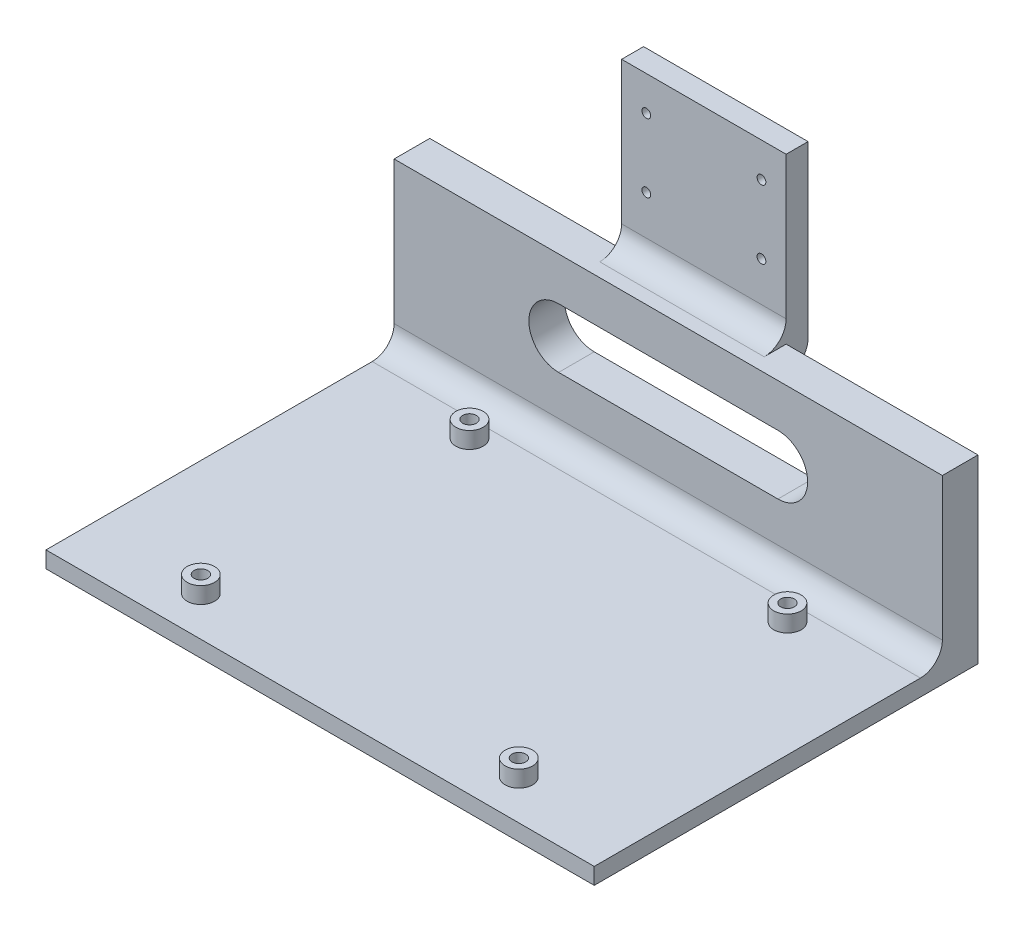
ISO-10303-21;
HEADER;
FILE_DESCRIPTION(('STEP AP214'),'2;1');
FILE_NAME('part.step','',(''),(''),'','','');
FILE_SCHEMA(('AUTOMOTIVE_DESIGN { 1 0 10303 214 1 1 1 1 }'));
ENDSEC;
DATA;
#1=APPLICATION_CONTEXT('core data for automotive mechanical design processes');
#2=APPLICATION_PROTOCOL_DEFINITION('international standard','automotive_design',2000,#1);
#3=PRODUCT_CONTEXT('',#1,'mechanical');
#4=PRODUCT('Part','Part','',(#3));
#5=PRODUCT_RELATED_PRODUCT_CATEGORY('part','',(#4));
#6=PRODUCT_DEFINITION_FORMATION('','',#4);
#7=PRODUCT_DEFINITION_CONTEXT('part definition',#1,'design');
#8=PRODUCT_DEFINITION('design','',#6,#7);
#9=PRODUCT_DEFINITION_SHAPE('','',#8);
#10=(LENGTH_UNIT() NAMED_UNIT(*) SI_UNIT(.MILLI.,.METRE.));
#11=(NAMED_UNIT(*) PLANE_ANGLE_UNIT() SI_UNIT($,.RADIAN.));
#12=(NAMED_UNIT(*) SI_UNIT($,.STERADIAN.) SOLID_ANGLE_UNIT());
#13=UNCERTAINTY_MEASURE_WITH_UNIT(LENGTH_MEASURE(1.E-05),#10,'distance_accuracy_value','');
#14=(GEOMETRIC_REPRESENTATION_CONTEXT(3) GLOBAL_UNCERTAINTY_ASSIGNED_CONTEXT((#13)) GLOBAL_UNIT_ASSIGNED_CONTEXT((#10,
#11,#12)) REPRESENTATION_CONTEXT('',''));
#15=CARTESIAN_POINT('',(0.,0.,0.));
#16=DIRECTION('',(0.,0.,1.));
#17=DIRECTION('',(1.,0.,0.));
#18=AXIS2_PLACEMENT_3D('',#15,#16,#17);
#19=CARTESIAN_POINT('',(50.,3.,-35.));
#20=DIRECTION('',(0.,0.,1.));
#21=DIRECTION('',(1.,0.,0.));
#22=AXIS2_PLACEMENT_3D('',#19,#20,#21);
#23=PLANE('',#22);
#24=DIRECTION('',(0.,1.,0.));
#25=VECTOR('',#24,1.);
#26=CARTESIAN_POINT('',(-15.,33.,-35.));
#27=LINE('',#26,#25);
#28=CARTESIAN_POINT('',(-15.,25.1356976526442,-35.));
#29=VERTEX_POINT('',#28);
#30=CARTESIAN_POINT('',(-15.,33.,-35.));
#31=VERTEX_POINT('',#30);
#32=EDGE_CURVE('E301',#29,#31,#27,.T.);
#33=ORIENTED_EDGE('',*,*,#32,.F.);
#34=DIRECTION('',(-1.,0.,0.));
#35=VECTOR('',#34,1.);
#36=CARTESIAN_POINT('',(50.,25.1356976526442,-35.));
#37=LINE('',#36,#35);
#38=CARTESIAN_POINT('',(-20.,25.1356976526442,-35.));
#39=VERTEX_POINT('',#38);
#40=EDGE_CURVE('E229',#29,#39,#37,.T.);
#41=ORIENTED_EDGE('',*,*,#40,.T.);
#42=CARTESIAN_POINT('',(-20.,19.7115763338752,-35.));
#43=DIRECTION('',(0.,0.,1.));
#44=DIRECTION('',(1.,0.,0.));
#45=AXIS2_PLACEMENT_3D('',#42,#43,#44);
#46=CIRCLE('',#45,5.42412131876902);
#47=CARTESIAN_POINT('',(-20.,14.2874550151061,-35.));
#48=VERTEX_POINT('',#47);
#49=EDGE_CURVE('E239',#39,#48,#46,.T.);
#50=ORIENTED_EDGE('',*,*,#49,.T.);
#51=DIRECTION('',(1.,0.,0.));
#52=VECTOR('',#51,1.);
#53=CARTESIAN_POINT('',(50.,14.2874550151061,-35.));
#54=LINE('',#53,#52);
#55=CARTESIAN_POINT('',(20.,14.2874550151061,-35.));
#56=VERTEX_POINT('',#55);
#57=EDGE_CURVE('E234',#48,#56,#54,.T.);
#58=ORIENTED_EDGE('',*,*,#57,.T.);
#59=CARTESIAN_POINT('',(20.,19.7115763338752,-35.));
#60=DIRECTION('',(0.,0.,1.));
#61=DIRECTION('',(1.,0.,0.));
#62=AXIS2_PLACEMENT_3D('',#59,#60,#61);
#63=CIRCLE('',#62,5.42412131876902);
#64=CARTESIAN_POINT('',(20.,25.1356976526442,-35.));
#65=VERTEX_POINT('',#64);
#66=EDGE_CURVE('E193',#56,#65,#63,.T.);
#67=ORIENTED_EDGE('',*,*,#66,.T.);
#68=CARTESIAN_POINT('',(15.,25.1356976526442,-35.));
#69=VERTEX_POINT('',#68);
#70=EDGE_CURVE('E233',#65,#69,#37,.T.);
#71=ORIENTED_EDGE('',*,*,#70,.T.);
#72=DIRECTION('',(0.,-1.,0.));
#73=VECTOR('',#72,1.);
#74=CARTESIAN_POINT('',(15.,33.,-35.));
#75=LINE('',#74,#73);
#76=CARTESIAN_POINT('',(15.,33.,-35.));
#77=VERTEX_POINT('',#76);
#78=EDGE_CURVE('E295',#77,#69,#75,.T.);
#79=ORIENTED_EDGE('',*,*,#78,.F.);
#80=DIRECTION('',(-1.,0.,0.));
#81=VECTOR('',#80,1.);
#82=CARTESIAN_POINT('',(-50.,33.,-35.));
#83=LINE('',#82,#81);
#84=CARTESIAN_POINT('',(50.,33.,-35.));
#85=VERTEX_POINT('',#84);
#86=EDGE_CURVE('E369',#85,#77,#83,.T.);
#87=ORIENTED_EDGE('',*,*,#86,.F.);
#88=DIRECTION('',(0.,-1.,0.));
#89=VECTOR('',#88,1.);
#90=CARTESIAN_POINT('',(50.,3.,-35.));
#91=LINE('',#90,#89);
#92=CARTESIAN_POINT('',(50.,0.,-35.));
#93=VERTEX_POINT('',#92);
#94=EDGE_CURVE('E408',#85,#93,#91,.T.);
#95=ORIENTED_EDGE('',*,*,#94,.T.);
#96=DIRECTION('',(-1.,0.,0.));
#97=VECTOR('',#96,1.);
#98=CARTESIAN_POINT('',(50.,0.,-35.));
#99=LINE('',#98,#97);
#100=CARTESIAN_POINT('',(-50.,0.,-35.));
#101=VERTEX_POINT('',#100);
#102=EDGE_CURVE('E386',#93,#101,#99,.T.);
#103=ORIENTED_EDGE('',*,*,#102,.T.);
#104=DIRECTION('',(0.,-1.,0.));
#105=VECTOR('',#104,1.);
#106=CARTESIAN_POINT('',(-50.,3.,-35.));
#107=LINE('',#106,#105);
#108=CARTESIAN_POINT('',(-50.,33.,-35.));
#109=VERTEX_POINT('',#108);
#110=EDGE_CURVE('E393',#109,#101,#107,.T.);
#111=ORIENTED_EDGE('',*,*,#110,.F.);
#112=EDGE_CURVE('E368',#31,#109,#83,.T.);
#113=ORIENTED_EDGE('',*,*,#112,.F.);
#114=EDGE_LOOP('',(#33,#41,#50,#58,#67,#71,#79,#87,#95,#103,#111,#113));
#115=FACE_BOUND('',#114,.T.);
#116=ADVANCED_FACE('F47',(#115),#23,.F.);
#117=CARTESIAN_POINT('',(29.,6.,27.75));
#118=DIRECTION('',(0.,-1.,0.));
#119=DIRECTION('',(0.,0.,-1.));
#120=AXIS2_PLACEMENT_3D('',#117,#118,#119);
#121=PLANE('',#120);
#122=CARTESIAN_POINT('',(29.,6.,27.75));
#123=DIRECTION('',(0.,-1.,0.));
#124=DIRECTION('',(0.,0.,-1.));
#125=AXIS2_PLACEMENT_3D('',#122,#123,#124);
#126=CIRCLE('',#125,2.5);
#127=CARTESIAN_POINT('',(29.,6.,25.25));
#128=VERTEX_POINT('',#127);
#129=EDGE_CURVE('E341',#128,#128,#126,.T.);
#130=ORIENTED_EDGE('',*,*,#129,.F.);
#131=EDGE_LOOP('',(#130));
#132=FACE_BOUND('',#131,.T.);
#133=CARTESIAN_POINT('',(29.,6.,27.75));
#134=DIRECTION('',(0.,1.,0.));
#135=DIRECTION('',(0.,0.,1.));
#136=AXIS2_PLACEMENT_3D('',#133,#134,#135);
#137=CIRCLE('',#136,1.25);
#138=CARTESIAN_POINT('',(29.,6.,29.));
#139=VERTEX_POINT('',#138);
#140=EDGE_CURVE('E325',#139,#139,#137,.T.);
#141=ORIENTED_EDGE('',*,*,#140,.F.);
#142=EDGE_LOOP('',(#141));
#143=FACE_BOUND('',#142,.T.);
#144=ADVANCED_FACE('F574',(#132,#143),#121,.F.);
#145=CARTESIAN_POINT('',(-50.,3.,35.));
#146=DIRECTION('',(1.,0.,0.));
#147=DIRECTION('',(0.,0.,-1.));
#148=AXIS2_PLACEMENT_3D('',#145,#146,#147);
#149=PLANE('',#148);
#150=DIRECTION('',(0.,0.,1.));
#151=VECTOR('',#150,1.);
#152=CARTESIAN_POINT('',(-50.,0.,35.));
#153=LINE('',#152,#151);
#154=CARTESIAN_POINT('',(-50.,0.,35.));
#155=VERTEX_POINT('',#154);
#156=EDGE_CURVE('E381',#101,#155,#153,.T.);
#157=ORIENTED_EDGE('',*,*,#156,.T.);
#158=DIRECTION('',(0.,-1.,0.));
#159=VECTOR('',#158,1.);
#160=CARTESIAN_POINT('',(-50.,3.,35.));
#161=LINE('',#160,#159);
#162=CARTESIAN_POINT('',(-50.,3.,35.));
#163=VERTEX_POINT('',#162);
#164=EDGE_CURVE('E416',#163,#155,#161,.T.);
#165=ORIENTED_EDGE('',*,*,#164,.F.);
#166=DIRECTION('',(0.,0.,1.));
#167=VECTOR('',#166,1.);
#168=CARTESIAN_POINT('',(-50.,3.,35.));
#169=LINE('',#168,#167);
#170=CARTESIAN_POINT('',(-50.,3.,-24.5));
#171=VERTEX_POINT('',#170);
#172=EDGE_CURVE('E382',#171,#163,#169,.T.);
#173=ORIENTED_EDGE('',*,*,#172,.F.);
#174=CARTESIAN_POINT('',(-50.,7.,-24.5));
#175=DIRECTION('',(1.,0.,0.));
#176=DIRECTION('',(0.,0.,-1.));
#177=AXIS2_PLACEMENT_3D('',#174,#175,#176);
#178=CIRCLE('',#177,4.);
#179=CARTESIAN_POINT('',(-50.,7.,-28.5));
#180=VERTEX_POINT('',#179);
#181=EDGE_CURVE('E56',#171,#180,#178,.T.);
#182=ORIENTED_EDGE('',*,*,#181,.T.);
#183=DIRECTION('',(0.,-1.,0.));
#184=VECTOR('',#183,1.);
#185=CARTESIAN_POINT('',(-50.,33.,-28.5));
#186=LINE('',#185,#184);
#187=CARTESIAN_POINT('',(-50.,33.,-28.5));
#188=VERTEX_POINT('',#187);
#189=EDGE_CURVE('E377',#188,#180,#186,.T.);
#190=ORIENTED_EDGE('',*,*,#189,.F.);
#191=DIRECTION('',(0.,0.,1.));
#192=VECTOR('',#191,1.);
#193=CARTESIAN_POINT('',(-50.,33.,-35.));
#194=LINE('',#193,#192);
#195=EDGE_CURVE('E357',#109,#188,#194,.T.);
#196=ORIENTED_EDGE('',*,*,#195,.F.);
#197=ORIENTED_EDGE('',*,*,#110,.T.);
#198=EDGE_LOOP('',(#157,#165,#173,#182,#190,#196,#197));
#199=FACE_BOUND('',#198,.T.);
#200=ADVANCED_FACE('F496',(#199),#149,.F.);
#201=CARTESIAN_POINT('',(50.,3.,35.));
#202=DIRECTION('',(0.,0.,-1.));
#203=DIRECTION('',(-1.,0.,0.));
#204=AXIS2_PLACEMENT_3D('',#201,#202,#203);
#205=PLANE('',#204);
#206=DIRECTION('',(1.,0.,0.));
#207=VECTOR('',#206,1.);
#208=CARTESIAN_POINT('',(50.,0.,35.));
#209=LINE('',#208,#207);
#210=CARTESIAN_POINT('',(50.,0.,35.));
#211=VERTEX_POINT('',#210);
#212=EDGE_CURVE('E397',#155,#211,#209,.T.);
#213=ORIENTED_EDGE('',*,*,#212,.T.);
#214=DIRECTION('',(0.,-1.,0.));
#215=VECTOR('',#214,1.);
#216=CARTESIAN_POINT('',(50.,3.,35.));
#217=LINE('',#216,#215);
#218=CARTESIAN_POINT('',(50.,3.,35.));
#219=VERTEX_POINT('',#218);
#220=EDGE_CURVE('E412',#219,#211,#217,.T.);
#221=ORIENTED_EDGE('',*,*,#220,.F.);
#222=DIRECTION('',(1.,0.,0.));
#223=VECTOR('',#222,1.);
#224=CARTESIAN_POINT('',(50.,3.,35.));
#225=LINE('',#224,#223);
#226=EDGE_CURVE('E385',#163,#219,#225,.T.);
#227=ORIENTED_EDGE('',*,*,#226,.F.);
#228=ORIENTED_EDGE('',*,*,#164,.T.);
#229=EDGE_LOOP('',(#213,#221,#227,#228));
#230=FACE_BOUND('',#229,.T.);
#231=ADVANCED_FACE('F512',(#230),#205,.F.);
#232=CARTESIAN_POINT('',(50.,3.,35.));
#233=DIRECTION('',(-1.,0.,0.));
#234=DIRECTION('',(0.,0.,1.));
#235=AXIS2_PLACEMENT_3D('',#232,#233,#234);
#236=PLANE('',#235);
#237=DIRECTION('',(0.,0.,-1.));
#238=VECTOR('',#237,1.);
#239=CARTESIAN_POINT('',(50.,0.,35.));
#240=LINE('',#239,#238);
#241=EDGE_CURVE('E400',#211,#93,#240,.T.);
#242=ORIENTED_EDGE('',*,*,#241,.T.);
#243=ORIENTED_EDGE('',*,*,#94,.F.);
#244=DIRECTION('',(0.,0.,-1.));
#245=VECTOR('',#244,1.);
#246=CARTESIAN_POINT('',(50.,33.,-35.));
#247=LINE('',#246,#245);
#248=CARTESIAN_POINT('',(50.,33.,-28.5));
#249=VERTEX_POINT('',#248);
#250=EDGE_CURVE('E364',#249,#85,#247,.T.);
#251=ORIENTED_EDGE('',*,*,#250,.F.);
#252=DIRECTION('',(0.,-1.,0.));
#253=VECTOR('',#252,1.);
#254=CARTESIAN_POINT('',(50.,33.,-28.5));
#255=LINE('',#254,#253);
#256=CARTESIAN_POINT('',(50.,7.,-28.5));
#257=VERTEX_POINT('',#256);
#258=EDGE_CURVE('E373',#249,#257,#255,.T.);
#259=ORIENTED_EDGE('',*,*,#258,.T.);
#260=CARTESIAN_POINT('',(50.,7.,-24.5));
#261=DIRECTION('',(-1.,0.,0.));
#262=DIRECTION('',(0.,0.,1.));
#263=AXIS2_PLACEMENT_3D('',#260,#261,#262);
#264=CIRCLE('',#263,4.);
#265=CARTESIAN_POINT('',(50.,3.,-24.5));
#266=VERTEX_POINT('',#265);
#267=EDGE_CURVE('E489',#257,#266,#264,.T.);
#268=ORIENTED_EDGE('',*,*,#267,.T.);
#269=DIRECTION('',(0.,0.,-1.));
#270=VECTOR('',#269,1.);
#271=CARTESIAN_POINT('',(50.,3.,35.));
#272=LINE('',#271,#270);
#273=EDGE_CURVE('E389',#219,#266,#272,.T.);
#274=ORIENTED_EDGE('',*,*,#273,.F.);
#275=ORIENTED_EDGE('',*,*,#220,.T.);
#276=EDGE_LOOP('',(#242,#243,#251,#259,#268,#274,#275));
#277=FACE_BOUND('',#276,.T.);
#278=ADVANCED_FACE('F505',(#277),#236,.F.);
#279=CARTESIAN_POINT('',(0.,3.,0.));
#280=DIRECTION('',(0.,1.,0.));
#281=DIRECTION('',(0.,0.,1.));
#282=AXIS2_PLACEMENT_3D('',#279,#280,#281);
#283=PLANE('',#282);
#284=CARTESIAN_POINT('',(-29.,3.,27.75));
#285=DIRECTION('',(0.,1.,0.));
#286=DIRECTION('',(0.,0.,1.));
#287=AXIS2_PLACEMENT_3D('',#284,#285,#286);
#288=CIRCLE('',#287,2.5);
#289=CARTESIAN_POINT('',(-29.,3.,30.25));
#290=VERTEX_POINT('',#289);
#291=EDGE_CURVE('E432',#290,#290,#288,.T.);
#292=ORIENTED_EDGE('',*,*,#291,.F.);
#293=EDGE_LOOP('',(#292));
#294=FACE_BOUND('',#293,.T.);
#295=CARTESIAN_POINT('',(29.,3.,-21.25));
#296=DIRECTION('',(0.,1.,0.));
#297=DIRECTION('',(0.,0.,1.));
#298=AXIS2_PLACEMENT_3D('',#295,#296,#297);
#299=CIRCLE('',#298,2.5);
#300=CARTESIAN_POINT('',(29.,3.,-18.75));
#301=VERTEX_POINT('',#300);
#302=EDGE_CURVE('E428',#301,#301,#299,.T.);
#303=ORIENTED_EDGE('',*,*,#302,.F.);
#304=EDGE_LOOP('',(#303));
#305=FACE_BOUND('',#304,.T.);
#306=CARTESIAN_POINT('',(29.,3.,27.75));
#307=DIRECTION('',(0.,1.,0.));
#308=DIRECTION('',(0.,0.,1.));
#309=AXIS2_PLACEMENT_3D('',#306,#307,#308);
#310=CIRCLE('',#309,2.5);
#311=CARTESIAN_POINT('',(29.,3.,30.25));
#312=VERTEX_POINT('',#311);
#313=EDGE_CURVE('E424',#312,#312,#310,.T.);
#314=ORIENTED_EDGE('',*,*,#313,.F.);
#315=EDGE_LOOP('',(#314));
#316=FACE_BOUND('',#315,.T.);
#317=CARTESIAN_POINT('',(-29.,3.,-21.25));
#318=DIRECTION('',(0.,1.,0.));
#319=DIRECTION('',(0.,0.,1.));
#320=AXIS2_PLACEMENT_3D('',#317,#318,#319);
#321=CIRCLE('',#320,2.5);
#322=CARTESIAN_POINT('',(-29.,3.,-18.75));
#323=VERTEX_POINT('',#322);
#324=EDGE_CURVE('E420',#323,#323,#321,.T.);
#325=ORIENTED_EDGE('',*,*,#324,.F.);
#326=EDGE_LOOP('',(#325));
#327=FACE_BOUND('',#326,.T.);
#328=ORIENTED_EDGE('',*,*,#273,.T.);
#329=DIRECTION('',(1.,0.,0.));
#330=VECTOR('',#329,1.);
#331=CARTESIAN_POINT('',(0.,3.,-24.5));
#332=LINE('',#331,#330);
#333=EDGE_CURVE('E486',#266,#171,#332,.F.);
#334=ORIENTED_EDGE('',*,*,#333,.T.);
#335=ORIENTED_EDGE('',*,*,#172,.T.);
#336=ORIENTED_EDGE('',*,*,#226,.T.);
#337=EDGE_LOOP('',(#328,#334,#335,#336));
#338=FACE_BOUND('',#337,.T.);
#339=ADVANCED_FACE('F508',(#294,#305,#316,#327,#338),#283,.T.);
#340=CARTESIAN_POINT('',(0.,0.,0.));
#341=DIRECTION('',(0.,1.,0.));
#342=DIRECTION('',(0.,0.,1.));
#343=AXIS2_PLACEMENT_3D('',#340,#341,#342);
#344=PLANE('',#343);
#345=CARTESIAN_POINT('',(-29.,0.,-21.25));
#346=DIRECTION('',(0.,1.,0.));
#347=DIRECTION('',(0.,0.,1.));
#348=AXIS2_PLACEMENT_3D('',#345,#346,#347);
#349=CIRCLE('',#348,1.25);
#350=CARTESIAN_POINT('',(-29.,0.,-20.));
#351=VERTEX_POINT('',#350);
#352=EDGE_CURVE('E313',#351,#351,#349,.T.);
#353=ORIENTED_EDGE('',*,*,#352,.T.);
#354=EDGE_LOOP('',(#353));
#355=FACE_BOUND('',#354,.T.);
#356=CARTESIAN_POINT('',(29.,0.,-21.25));
#357=DIRECTION('',(0.,1.,0.));
#358=DIRECTION('',(0.,0.,1.));
#359=AXIS2_PLACEMENT_3D('',#356,#357,#358);
#360=CIRCLE('',#359,1.25);
#361=CARTESIAN_POINT('',(29.,0.,-20.));
#362=VERTEX_POINT('',#361);
#363=EDGE_CURVE('E321',#362,#362,#360,.T.);
#364=ORIENTED_EDGE('',*,*,#363,.T.);
#365=EDGE_LOOP('',(#364));
#366=FACE_BOUND('',#365,.T.);
#367=CARTESIAN_POINT('',(29.,0.,27.75));
#368=DIRECTION('',(0.,1.,0.));
#369=DIRECTION('',(0.,0.,1.));
#370=AXIS2_PLACEMENT_3D('',#367,#368,#369);
#371=CIRCLE('',#370,1.25);
#372=CARTESIAN_POINT('',(29.,0.,29.));
#373=VERTEX_POINT('',#372);
#374=EDGE_CURVE('E329',#373,#373,#371,.T.);
#375=ORIENTED_EDGE('',*,*,#374,.T.);
#376=EDGE_LOOP('',(#375));
#377=FACE_BOUND('',#376,.T.);
#378=CARTESIAN_POINT('',(-29.,0.,27.75));
#379=DIRECTION('',(0.,1.,0.));
#380=DIRECTION('',(0.,0.,1.));
#381=AXIS2_PLACEMENT_3D('',#378,#379,#380);
#382=CIRCLE('',#381,1.25);
#383=CARTESIAN_POINT('',(-29.,0.,29.));
#384=VERTEX_POINT('',#383);
#385=EDGE_CURVE('E337',#384,#384,#382,.T.);
#386=ORIENTED_EDGE('',*,*,#385,.T.);
#387=EDGE_LOOP('',(#386));
#388=FACE_BOUND('',#387,.T.);
#389=ORIENTED_EDGE('',*,*,#156,.F.);
#390=ORIENTED_EDGE('',*,*,#102,.F.);
#391=ORIENTED_EDGE('',*,*,#241,.F.);
#392=ORIENTED_EDGE('',*,*,#212,.F.);
#393=EDGE_LOOP('',(#389,#390,#391,#392));
#394=FACE_BOUND('',#393,.T.);
#395=ADVANCED_FACE('F517',(#355,#366,#377,#388,#394),#344,.F.);
#396=CARTESIAN_POINT('',(-50.,33.,-28.5));
#397=DIRECTION('',(0.,0.,-1.));
#398=DIRECTION('',(-1.,0.,0.));
#399=AXIS2_PLACEMENT_3D('',#396,#397,#398);
#400=PLANE('',#399);
#401=DIRECTION('',(1.,0.,0.));
#402=VECTOR('',#401,1.);
#403=CARTESIAN_POINT('',(-20.,14.2874550151061,-28.5));
#404=LINE('',#403,#402);
#405=CARTESIAN_POINT('',(-20.,14.2874550151061,-28.5));
#406=VERTEX_POINT('',#405);
#407=CARTESIAN_POINT('',(20.,14.2874550151061,-28.5));
#408=VERTEX_POINT('',#407);
#409=EDGE_CURVE('E201',#406,#408,#404,.T.);
#410=ORIENTED_EDGE('',*,*,#409,.F.);
#411=CARTESIAN_POINT('',(-20.,19.7115763338752,-28.5));
#412=DIRECTION('',(0.,0.,1.));
#413=DIRECTION('',(1.,0.,0.));
#414=AXIS2_PLACEMENT_3D('',#411,#412,#413);
#415=CIRCLE('',#414,5.42412131876902);
#416=CARTESIAN_POINT('',(-20.,25.1356976526442,-28.5));
#417=VERTEX_POINT('',#416);
#418=EDGE_CURVE('E63',#417,#406,#415,.T.);
#419=ORIENTED_EDGE('',*,*,#418,.F.);
#420=DIRECTION('',(-1.,0.,0.));
#421=VECTOR('',#420,1.);
#422=CARTESIAN_POINT('',(-20.,25.1356976526442,-28.5));
#423=LINE('',#422,#421);
#424=CARTESIAN_POINT('',(20.,25.1356976526442,-28.5));
#425=VERTEX_POINT('',#424);
#426=EDGE_CURVE('E209',#425,#417,#423,.T.);
#427=ORIENTED_EDGE('',*,*,#426,.F.);
#428=CARTESIAN_POINT('',(20.,19.7115763338752,-28.5));
#429=DIRECTION('',(0.,0.,1.));
#430=DIRECTION('',(1.,0.,0.));
#431=AXIS2_PLACEMENT_3D('',#428,#429,#430);
#432=CIRCLE('',#431,5.42412131876902);
#433=EDGE_CURVE('E190',#408,#425,#432,.T.);
#434=ORIENTED_EDGE('',*,*,#433,.F.);
#435=EDGE_LOOP('',(#410,#419,#427,#434));
#436=FACE_BOUND('',#435,.T.);
#437=ORIENTED_EDGE('',*,*,#189,.T.);
#438=DIRECTION('',(1.,0.,0.));
#439=VECTOR('',#438,1.);
#440=CARTESIAN_POINT('',(-50.,7.,-28.5));
#441=LINE('',#440,#439);
#442=EDGE_CURVE('E479',#180,#257,#441,.T.);
#443=ORIENTED_EDGE('',*,*,#442,.T.);
#444=ORIENTED_EDGE('',*,*,#258,.F.);
#445=DIRECTION('',(1.,0.,0.));
#446=VECTOR('',#445,1.);
#447=CARTESIAN_POINT('',(-50.,33.,-28.5));
#448=LINE('',#447,#446);
#449=EDGE_CURVE('E361',#188,#249,#448,.T.);
#450=ORIENTED_EDGE('',*,*,#449,.F.);
#451=EDGE_LOOP('',(#437,#443,#444,#450));
#452=FACE_BOUND('',#451,.T.);
#453=ADVANCED_FACE('F206',(#436,#452),#400,.F.);
#454=CARTESIAN_POINT('',(0.,33.,0.));
#455=DIRECTION('',(0.,1.,0.));
#456=DIRECTION('',(0.,0.,1.));
#457=AXIS2_PLACEMENT_3D('',#454,#455,#456);
#458=PLANE('',#457);
#459=ORIENTED_EDGE('',*,*,#86,.T.);
#460=DIRECTION('',(0.,0.,1.));
#461=VECTOR('',#460,1.);
#462=CARTESIAN_POINT('',(15.,33.,0.));
#463=LINE('',#462,#461);
#464=CARTESIAN_POINT('',(15.,33.,-31.));
#465=VERTEX_POINT('',#464);
#466=EDGE_CURVE('E448',#77,#465,#463,.T.);
#467=ORIENTED_EDGE('',*,*,#466,.T.);
#468=DIRECTION('',(1.,0.,0.));
#469=VECTOR('',#468,1.);
#470=CARTESIAN_POINT('',(0.,33.,-31.));
#471=LINE('',#470,#469);
#472=CARTESIAN_POINT('',(-15.,33.,-31.));
#473=VERTEX_POINT('',#472);
#474=EDGE_CURVE('E444',#465,#473,#471,.F.);
#475=ORIENTED_EDGE('',*,*,#474,.T.);
#476=DIRECTION('',(0.,0.,-1.));
#477=VECTOR('',#476,1.);
#478=CARTESIAN_POINT('',(-15.,33.,0.));
#479=LINE('',#478,#477);
#480=EDGE_CURVE('E440',#473,#31,#479,.T.);
#481=ORIENTED_EDGE('',*,*,#480,.T.);
#482=ORIENTED_EDGE('',*,*,#112,.T.);
#483=ORIENTED_EDGE('',*,*,#195,.T.);
#484=ORIENTED_EDGE('',*,*,#449,.T.);
#485=ORIENTED_EDGE('',*,*,#250,.T.);
#486=EDGE_LOOP('',(#459,#467,#475,#481,#482,#483,#484,#485));
#487=FACE_BOUND('',#486,.T.);
#488=ADVANCED_FACE('F524',(#487),#458,.T.);
#489=CARTESIAN_POINT('',(-29.,6.,-21.25));
#490=DIRECTION('',(0.,-1.,0.));
#491=DIRECTION('',(0.,0.,-1.));
#492=AXIS2_PLACEMENT_3D('',#489,#490,#491);
#493=CYLINDRICAL_SURFACE('',#492,2.5);
#494=CARTESIAN_POINT('',(-29.,6.,-21.25));
#495=DIRECTION('',(0.,-1.,0.));
#496=DIRECTION('',(0.,0.,-1.));
#497=AXIS2_PLACEMENT_3D('',#494,#495,#496);
#498=CIRCLE('',#497,2.5);
#499=CARTESIAN_POINT('',(-29.,6.,-23.75));
#500=VERTEX_POINT('',#499);
#501=EDGE_CURVE('E350',#500,#500,#498,.T.);
#502=ORIENTED_EDGE('',*,*,#501,.T.);
#503=EDGE_LOOP('',(#502));
#504=FACE_BOUND('',#503,.T.);
#505=ORIENTED_EDGE('',*,*,#324,.T.);
#506=EDGE_LOOP('',(#505));
#507=FACE_BOUND('',#506,.T.);
#508=ADVANCED_FACE('F661',(#504,#507),#493,.T.);
#509=CARTESIAN_POINT('',(-29.,6.,-21.25));
#510=DIRECTION('',(0.,-1.,0.));
#511=DIRECTION('',(0.,0.,-1.));
#512=AXIS2_PLACEMENT_3D('',#509,#510,#511);
#513=PLANE('',#512);
#514=CARTESIAN_POINT('',(-29.,6.,-21.25));
#515=DIRECTION('',(0.,1.,0.));
#516=DIRECTION('',(0.,0.,1.));
#517=AXIS2_PLACEMENT_3D('',#514,#515,#516);
#518=CIRCLE('',#517,1.25);
#519=CARTESIAN_POINT('',(-29.,6.,-20.));
#520=VERTEX_POINT('',#519);
#521=EDGE_CURVE('E304',#520,#520,#518,.T.);
#522=ORIENTED_EDGE('',*,*,#521,.F.);
#523=EDGE_LOOP('',(#522));
#524=FACE_BOUND('',#523,.T.);
#525=ORIENTED_EDGE('',*,*,#501,.F.);
#526=EDGE_LOOP('',(#525));
#527=FACE_BOUND('',#526,.T.);
#528=ADVANCED_FACE('F642',(#524,#527),#513,.F.);
#529=CARTESIAN_POINT('',(29.,6.,27.75));
#530=DIRECTION('',(0.,-1.,0.));
#531=DIRECTION('',(0.,0.,-1.));
#532=AXIS2_PLACEMENT_3D('',#529,#530,#531);
#533=CYLINDRICAL_SURFACE('',#532,2.5);
#534=ORIENTED_EDGE('',*,*,#129,.T.);
#535=EDGE_LOOP('',(#534));
#536=FACE_BOUND('',#535,.T.);
#537=ORIENTED_EDGE('',*,*,#313,.T.);
#538=EDGE_LOOP('',(#537));
#539=FACE_BOUND('',#538,.T.);
#540=ADVANCED_FACE('F639',(#536,#539),#533,.T.);
#541=CARTESIAN_POINT('',(29.,6.,-21.25));
#542=DIRECTION('',(0.,-1.,0.));
#543=DIRECTION('',(0.,0.,-1.));
#544=AXIS2_PLACEMENT_3D('',#541,#542,#543);
#545=CYLINDRICAL_SURFACE('',#544,2.5);
#546=CARTESIAN_POINT('',(29.,6.,-21.25));
#547=DIRECTION('',(0.,-1.,0.));
#548=DIRECTION('',(0.,0.,-1.));
#549=AXIS2_PLACEMENT_3D('',#546,#547,#548);
#550=CIRCLE('',#549,2.5);
#551=CARTESIAN_POINT('',(29.,6.,-23.75));
#552=VERTEX_POINT('',#551);
#553=EDGE_CURVE('E345',#552,#552,#550,.T.);
#554=ORIENTED_EDGE('',*,*,#553,.T.);
#555=EDGE_LOOP('',(#554));
#556=FACE_BOUND('',#555,.T.);
#557=ORIENTED_EDGE('',*,*,#302,.T.);
#558=EDGE_LOOP('',(#557));
#559=FACE_BOUND('',#558,.T.);
#560=ADVANCED_FACE('F641',(#556,#559),#545,.T.);
#561=CARTESIAN_POINT('',(29.,6.,-21.25));
#562=DIRECTION('',(0.,-1.,0.));
#563=DIRECTION('',(0.,0.,-1.));
#564=AXIS2_PLACEMENT_3D('',#561,#562,#563);
#565=PLANE('',#564);
#566=CARTESIAN_POINT('',(29.,6.,-21.25));
#567=DIRECTION('',(0.,1.,0.));
#568=DIRECTION('',(0.,0.,1.));
#569=AXIS2_PLACEMENT_3D('',#566,#567,#568);
#570=CIRCLE('',#569,1.25);
#571=CARTESIAN_POINT('',(29.,6.,-20.));
#572=VERTEX_POINT('',#571);
#573=EDGE_CURVE('E317',#572,#572,#570,.T.);
#574=ORIENTED_EDGE('',*,*,#573,.F.);
#575=EDGE_LOOP('',(#574));
#576=FACE_BOUND('',#575,.T.);
#577=ORIENTED_EDGE('',*,*,#553,.F.);
#578=EDGE_LOOP('',(#577));
#579=FACE_BOUND('',#578,.T.);
#580=ADVANCED_FACE('F648',(#576,#579),#565,.F.);
#581=CARTESIAN_POINT('',(-29.,6.,27.75));
#582=DIRECTION('',(0.,-1.,0.));
#583=DIRECTION('',(0.,0.,-1.));
#584=AXIS2_PLACEMENT_3D('',#581,#582,#583);
#585=CYLINDRICAL_SURFACE('',#584,2.5);
#586=CARTESIAN_POINT('',(-29.,6.,27.75));
#587=DIRECTION('',(0.,-1.,0.));
#588=DIRECTION('',(0.,0.,-1.));
#589=AXIS2_PLACEMENT_3D('',#586,#587,#588);
#590=CIRCLE('',#589,2.5);
#591=CARTESIAN_POINT('',(-29.,6.,25.25));
#592=VERTEX_POINT('',#591);
#593=EDGE_CURVE('E346',#592,#592,#590,.T.);
#594=ORIENTED_EDGE('',*,*,#593,.T.);
#595=EDGE_LOOP('',(#594));
#596=FACE_BOUND('',#595,.T.);
#597=ORIENTED_EDGE('',*,*,#291,.T.);
#598=EDGE_LOOP('',(#597));
#599=FACE_BOUND('',#598,.T.);
#600=ADVANCED_FACE('F645',(#596,#599),#585,.T.);
#601=CARTESIAN_POINT('',(-29.,6.,27.75));
#602=DIRECTION('',(0.,-1.,0.));
#603=DIRECTION('',(0.,0.,-1.));
#604=AXIS2_PLACEMENT_3D('',#601,#602,#603);
#605=PLANE('',#604);
#606=CARTESIAN_POINT('',(-29.,6.,27.75));
#607=DIRECTION('',(0.,1.,0.));
#608=DIRECTION('',(0.,0.,1.));
#609=AXIS2_PLACEMENT_3D('',#606,#607,#608);
#610=CIRCLE('',#609,1.25);
#611=CARTESIAN_POINT('',(-29.,6.,29.));
#612=VERTEX_POINT('',#611);
#613=EDGE_CURVE('E333',#612,#612,#610,.T.);
#614=ORIENTED_EDGE('',*,*,#613,.F.);
#615=EDGE_LOOP('',(#614));
#616=FACE_BOUND('',#615,.T.);
#617=ORIENTED_EDGE('',*,*,#593,.F.);
#618=EDGE_LOOP('',(#617));
#619=FACE_BOUND('',#618,.T.);
#620=ADVANCED_FACE('F637',(#616,#619),#605,.F.);
#621=CARTESIAN_POINT('',(-29.,6.,27.75));
#622=DIRECTION('',(0.,1.,0.));
#623=DIRECTION('',(0.,0.,1.));
#624=AXIS2_PLACEMENT_3D('',#621,#622,#623);
#625=CYLINDRICAL_SURFACE('',#624,1.25);
#626=ORIENTED_EDGE('',*,*,#385,.F.);
#627=EDGE_LOOP('',(#626));
#628=FACE_BOUND('',#627,.T.);
#629=ORIENTED_EDGE('',*,*,#613,.T.);
#630=EDGE_LOOP('',(#629));
#631=FACE_BOUND('',#630,.T.);
#632=ADVANCED_FACE('F633',(#628,#631),#625,.F.);
#633=CARTESIAN_POINT('',(29.,6.,27.75));
#634=DIRECTION('',(0.,1.,0.));
#635=DIRECTION('',(0.,0.,1.));
#636=AXIS2_PLACEMENT_3D('',#633,#634,#635);
#637=CYLINDRICAL_SURFACE('',#636,1.25);
#638=ORIENTED_EDGE('',*,*,#374,.F.);
#639=EDGE_LOOP('',(#638));
#640=FACE_BOUND('',#639,.T.);
#641=ORIENTED_EDGE('',*,*,#140,.T.);
#642=EDGE_LOOP('',(#641));
#643=FACE_BOUND('',#642,.T.);
#644=ADVANCED_FACE('F629',(#640,#643),#637,.F.);
#645=CARTESIAN_POINT('',(29.,6.,-21.25));
#646=DIRECTION('',(0.,1.,0.));
#647=DIRECTION('',(0.,0.,1.));
#648=AXIS2_PLACEMENT_3D('',#645,#646,#647);
#649=CYLINDRICAL_SURFACE('',#648,1.25);
#650=ORIENTED_EDGE('',*,*,#363,.F.);
#651=EDGE_LOOP('',(#650));
#652=FACE_BOUND('',#651,.T.);
#653=ORIENTED_EDGE('',*,*,#573,.T.);
#654=EDGE_LOOP('',(#653));
#655=FACE_BOUND('',#654,.T.);
#656=ADVANCED_FACE('F625',(#652,#655),#649,.F.);
#657=CARTESIAN_POINT('',(-29.,6.,-21.25));
#658=DIRECTION('',(0.,1.,0.));
#659=DIRECTION('',(0.,0.,1.));
#660=AXIS2_PLACEMENT_3D('',#657,#658,#659);
#661=CYLINDRICAL_SURFACE('',#660,1.25);
#662=ORIENTED_EDGE('',*,*,#352,.F.);
#663=EDGE_LOOP('',(#662));
#664=FACE_BOUND('',#663,.T.);
#665=ORIENTED_EDGE('',*,*,#521,.T.);
#666=EDGE_LOOP('',(#665));
#667=FACE_BOUND('',#666,.T.);
#668=ADVANCED_FACE('F622',(#664,#667),#661,.F.);
#669=CARTESIAN_POINT('',(15.,33.,-39.));
#670=DIRECTION('',(-1.,0.,0.));
#671=DIRECTION('',(0.,0.,1.));
#672=AXIS2_PLACEMENT_3D('',#669,#670,#671);
#673=PLANE('',#672);
#674=ORIENTED_EDGE('',*,*,#78,.T.);
#675=DIRECTION('',(0.,0.,-1.));
#676=VECTOR('',#675,1.);
#677=CARTESIAN_POINT('',(15.,25.1356976526442,-39.));
#678=LINE('',#677,#676);
#679=CARTESIAN_POINT('',(15.,25.1356976526442,-35.0023023942441));
#680=VERTEX_POINT('',#679);
#681=EDGE_CURVE('E225',#69,#680,#678,.T.);
#682=ORIENTED_EDGE('',*,*,#681,.T.);
#683=CARTESIAN_POINT('',(15.,25.,-39.));
#684=DIRECTION('',(-1.,0.,0.));
#685=DIRECTION('',(0.,0.,1.));
#686=AXIS2_PLACEMENT_3D('',#683,#684,#685);
#687=CIRCLE('',#686,4.);
#688=CARTESIAN_POINT('',(15.,28.4641016151378,-37.));
#689=VERTEX_POINT('',#688);
#690=EDGE_CURVE('E462',#680,#689,#687,.T.);
#691=ORIENTED_EDGE('',*,*,#690,.T.);
#692=CARTESIAN_POINT('',(15.,31.9282032302755,-35.));
#693=DIRECTION('',(-1.,0.,0.));
#694=DIRECTION('',(0.,0.,1.));
#695=AXIS2_PLACEMENT_3D('',#692,#693,#694);
#696=CIRCLE('',#695,4.);
#697=CARTESIAN_POINT('',(15.,31.9282032302755,-39.));
#698=VERTEX_POINT('',#697);
#699=EDGE_CURVE('E476',#689,#698,#696,.F.);
#700=ORIENTED_EDGE('',*,*,#699,.T.);
#701=DIRECTION('',(0.,-1.,0.));
#702=VECTOR('',#701,1.);
#703=CARTESIAN_POINT('',(15.,33.,-39.));
#704=LINE('',#703,#702);
#705=CARTESIAN_POINT('',(15.,63.,-39.));
#706=VERTEX_POINT('',#705);
#707=EDGE_CURVE('E296',#706,#698,#704,.T.);
#708=ORIENTED_EDGE('',*,*,#707,.F.);
#709=DIRECTION('',(0.,0.,-1.));
#710=VECTOR('',#709,1.);
#711=CARTESIAN_POINT('',(15.,63.,-39.));
#712=LINE('',#711,#710);
#713=CARTESIAN_POINT('',(15.,63.,-35.));
#714=VERTEX_POINT('',#713);
#715=EDGE_CURVE('E279',#714,#706,#712,.T.);
#716=ORIENTED_EDGE('',*,*,#715,.F.);
#717=DIRECTION('',(0.,-1.,0.));
#718=VECTOR('',#717,1.);
#719=CARTESIAN_POINT('',(15.,63.,-35.));
#720=LINE('',#719,#718);
#721=CARTESIAN_POINT('',(15.,37.,-35.));
#722=VERTEX_POINT('',#721);
#723=EDGE_CURVE('E287',#714,#722,#720,.T.);
#724=ORIENTED_EDGE('',*,*,#723,.T.);
#725=CARTESIAN_POINT('',(15.,37.,-31.));
#726=DIRECTION('',(-1.,0.,0.));
#727=DIRECTION('',(0.,0.,1.));
#728=AXIS2_PLACEMENT_3D('',#725,#726,#727);
#729=CIRCLE('',#728,4.);
#730=EDGE_CURVE('E452',#722,#465,#729,.T.);
#731=ORIENTED_EDGE('',*,*,#730,.T.);
#732=ORIENTED_EDGE('',*,*,#466,.F.);
#733=EDGE_LOOP('',(#674,#682,#691,#700,#708,#716,#724,#731,#732));
#734=FACE_BOUND('',#733,.T.);
#735=ADVANCED_FACE('F530',(#734),#673,.F.);
#736=CARTESIAN_POINT('',(-15.,33.,-39.));
#737=DIRECTION('',(1.,0.,0.));
#738=DIRECTION('',(0.,0.,-1.));
#739=AXIS2_PLACEMENT_3D('',#736,#737,#738);
#740=PLANE('',#739);
#741=CARTESIAN_POINT('',(-15.,25.,-39.));
#742=DIRECTION('',(1.,0.,0.));
#743=DIRECTION('',(0.,0.,-1.));
#744=AXIS2_PLACEMENT_3D('',#741,#742,#743);
#745=CIRCLE('',#744,4.);
#746=CARTESIAN_POINT('',(-15.,28.4641016151378,-37.));
#747=VERTEX_POINT('',#746);
#748=CARTESIAN_POINT('',(-15.,25.1356976526442,-35.0023023942441));
#749=VERTEX_POINT('',#748);
#750=EDGE_CURVE('E458',#747,#749,#745,.T.);
#751=ORIENTED_EDGE('',*,*,#750,.T.);
#752=DIRECTION('',(0.,0.,1.));
#753=VECTOR('',#752,1.);
#754=CARTESIAN_POINT('',(-15.,25.1356976526442,-39.));
#755=LINE('',#754,#753);
#756=EDGE_CURVE('E71',#749,#29,#755,.T.);
#757=ORIENTED_EDGE('',*,*,#756,.T.);
#758=ORIENTED_EDGE('',*,*,#32,.T.);
#759=ORIENTED_EDGE('',*,*,#480,.F.);
#760=CARTESIAN_POINT('',(-15.,37.,-31.));
#761=DIRECTION('',(1.,0.,0.));
#762=DIRECTION('',(0.,0.,-1.));
#763=AXIS2_PLACEMENT_3D('',#760,#761,#762);
#764=CIRCLE('',#763,4.);
#765=CARTESIAN_POINT('',(-15.,37.,-35.));
#766=VERTEX_POINT('',#765);
#767=EDGE_CURVE('E455',#473,#766,#764,.T.);
#768=ORIENTED_EDGE('',*,*,#767,.T.);
#769=DIRECTION('',(0.,-1.,0.));
#770=VECTOR('',#769,1.);
#771=CARTESIAN_POINT('',(-15.,63.,-35.));
#772=LINE('',#771,#770);
#773=CARTESIAN_POINT('',(-15.,63.,-35.));
#774=VERTEX_POINT('',#773);
#775=EDGE_CURVE('E291',#774,#766,#772,.T.);
#776=ORIENTED_EDGE('',*,*,#775,.F.);
#777=DIRECTION('',(0.,0.,1.));
#778=VECTOR('',#777,1.);
#779=CARTESIAN_POINT('',(-15.,63.,-39.));
#780=LINE('',#779,#778);
#781=CARTESIAN_POINT('',(-15.,63.,-39.));
#782=VERTEX_POINT('',#781);
#783=EDGE_CURVE('E272',#782,#774,#780,.T.);
#784=ORIENTED_EDGE('',*,*,#783,.F.);
#785=DIRECTION('',(0.,1.,0.));
#786=VECTOR('',#785,1.);
#787=CARTESIAN_POINT('',(-15.,33.,-39.));
#788=LINE('',#787,#786);
#789=CARTESIAN_POINT('',(-15.,31.9282032302755,-39.));
#790=VERTEX_POINT('',#789);
#791=EDGE_CURVE('E300',#790,#782,#788,.T.);
#792=ORIENTED_EDGE('',*,*,#791,.F.);
#793=CARTESIAN_POINT('',(-15.,31.9282032302755,-35.));
#794=DIRECTION('',(1.,0.,0.));
#795=DIRECTION('',(0.,0.,-1.));
#796=AXIS2_PLACEMENT_3D('',#793,#794,#795);
#797=CIRCLE('',#796,4.);
#798=EDGE_CURVE('E469',#790,#747,#797,.F.);
#799=ORIENTED_EDGE('',*,*,#798,.T.);
#800=EDGE_LOOP('',(#751,#757,#758,#759,#768,#776,#784,#792,#799));
#801=FACE_BOUND('',#800,.T.);
#802=ADVANCED_FACE('F539',(#801),#740,.F.);
#803=CARTESIAN_POINT('',(0.,0.,-39.));
#804=DIRECTION('',(0.,0.,-1.));
#805=DIRECTION('',(-1.,0.,0.));
#806=AXIS2_PLACEMENT_3D('',#803,#804,#805);
#807=PLANE('',#806);
#808=CARTESIAN_POINT('',(10.5,56.7286046947115,-39.));
#809=DIRECTION('',(0.,0.,-1.));
#810=DIRECTION('',(-1.,0.,0.));
#811=AXIS2_PLACEMENT_3D('',#808,#809,#810);
#812=CIRCLE('',#811,0.799999999999999);
#813=CARTESIAN_POINT('',(9.7,56.7286046947115,-39.));
#814=VERTEX_POINT('',#813);
#815=EDGE_CURVE('E243',#814,#814,#812,.T.);
#816=ORIENTED_EDGE('',*,*,#815,.F.);
#817=EDGE_LOOP('',(#816));
#818=FACE_BOUND('',#817,.T.);
#819=CARTESIAN_POINT('',(-10.5,56.7286046947115,-39.));
#820=DIRECTION('',(0.,0.,-1.));
#821=DIRECTION('',(-1.,0.,0.));
#822=AXIS2_PLACEMENT_3D('',#819,#820,#821);
#823=CIRCLE('',#822,0.799999999999999);
#824=CARTESIAN_POINT('',(-11.3,56.7286046947115,-39.));
#825=VERTEX_POINT('',#824);
#826=EDGE_CURVE('E251',#825,#825,#823,.T.);
#827=ORIENTED_EDGE('',*,*,#826,.F.);
#828=EDGE_LOOP('',(#827));
#829=FACE_BOUND('',#828,.T.);
#830=CARTESIAN_POINT('',(-10.5,44.2286046947115,-39.));
#831=DIRECTION('',(0.,0.,-1.));
#832=DIRECTION('',(-1.,0.,0.));
#833=AXIS2_PLACEMENT_3D('',#830,#831,#832);
#834=CIRCLE('',#833,0.799999999999999);
#835=CARTESIAN_POINT('',(-11.3,44.2286046947115,-39.));
#836=VERTEX_POINT('',#835);
#837=EDGE_CURVE('E259',#836,#836,#834,.T.);
#838=ORIENTED_EDGE('',*,*,#837,.F.);
#839=EDGE_LOOP('',(#838));
#840=FACE_BOUND('',#839,.T.);
#841=CARTESIAN_POINT('',(10.5,44.2286046947115,-39.));
#842=DIRECTION('',(0.,0.,-1.));
#843=DIRECTION('',(-1.,0.,0.));
#844=AXIS2_PLACEMENT_3D('',#841,#842,#843);
#845=CIRCLE('',#844,0.799999999999999);
#846=CARTESIAN_POINT('',(9.7,44.2286046947115,-39.));
#847=VERTEX_POINT('',#846);
#848=EDGE_CURVE('E267',#847,#847,#845,.T.);
#849=ORIENTED_EDGE('',*,*,#848,.F.);
#850=EDGE_LOOP('',(#849));
#851=FACE_BOUND('',#850,.T.);
#852=ORIENTED_EDGE('',*,*,#707,.T.);
#853=DIRECTION('',(-1.,0.,0.));
#854=VECTOR('',#853,1.);
#855=CARTESIAN_POINT('',(-15.,31.9282032302755,-39.));
#856=LINE('',#855,#854);
#857=EDGE_CURVE('E465',#698,#790,#856,.T.);
#858=ORIENTED_EDGE('',*,*,#857,.T.);
#859=ORIENTED_EDGE('',*,*,#791,.T.);
#860=DIRECTION('',(-1.,0.,0.));
#861=VECTOR('',#860,1.);
#862=CARTESIAN_POINT('',(-15.,63.,-39.));
#863=LINE('',#862,#861);
#864=EDGE_CURVE('E283',#706,#782,#863,.T.);
#865=ORIENTED_EDGE('',*,*,#864,.F.);
#866=EDGE_LOOP('',(#852,#858,#859,#865));
#867=FACE_BOUND('',#866,.T.);
#868=ADVANCED_FACE('F551',(#818,#829,#840,#851,#867),#807,.T.);
#869=CARTESIAN_POINT('',(-15.,63.,-35.));
#870=DIRECTION('',(0.,0.,-1.));
#871=DIRECTION('',(-1.,0.,0.));
#872=AXIS2_PLACEMENT_3D('',#869,#870,#871);
#873=PLANE('',#872);
#874=CARTESIAN_POINT('',(10.5,56.7286046947115,-35.));
#875=DIRECTION('',(0.,0.,-1.));
#876=DIRECTION('',(-1.,0.,0.));
#877=AXIS2_PLACEMENT_3D('',#874,#875,#876);
#878=CIRCLE('',#877,0.799999999999998);
#879=CARTESIAN_POINT('',(9.7,56.7286046947115,-35.));
#880=VERTEX_POINT('',#879);
#881=EDGE_CURVE('E247',#880,#880,#878,.T.);
#882=ORIENTED_EDGE('',*,*,#881,.T.);
#883=EDGE_LOOP('',(#882));
#884=FACE_BOUND('',#883,.T.);
#885=CARTESIAN_POINT('',(-10.5,56.7286046947115,-35.));
#886=DIRECTION('',(0.,0.,-1.));
#887=DIRECTION('',(-1.,0.,0.));
#888=AXIS2_PLACEMENT_3D('',#885,#886,#887);
#889=CIRCLE('',#888,0.799999999999998);
#890=CARTESIAN_POINT('',(-11.3,56.7286046947115,-35.));
#891=VERTEX_POINT('',#890);
#892=EDGE_CURVE('E255',#891,#891,#889,.T.);
#893=ORIENTED_EDGE('',*,*,#892,.T.);
#894=EDGE_LOOP('',(#893));
#895=FACE_BOUND('',#894,.T.);
#896=CARTESIAN_POINT('',(-10.5,44.2286046947115,-35.));
#897=DIRECTION('',(0.,0.,-1.));
#898=DIRECTION('',(-1.,0.,0.));
#899=AXIS2_PLACEMENT_3D('',#896,#897,#898);
#900=CIRCLE('',#899,0.799999999999998);
#901=CARTESIAN_POINT('',(-11.3,44.2286046947115,-35.));
#902=VERTEX_POINT('',#901);
#903=EDGE_CURVE('E263',#902,#902,#900,.T.);
#904=ORIENTED_EDGE('',*,*,#903,.T.);
#905=EDGE_LOOP('',(#904));
#906=FACE_BOUND('',#905,.T.);
#907=CARTESIAN_POINT('',(10.5,44.2286046947115,-35.));
#908=DIRECTION('',(0.,0.,-1.));
#909=DIRECTION('',(-1.,0.,0.));
#910=AXIS2_PLACEMENT_3D('',#907,#908,#909);
#911=CIRCLE('',#910,0.799999999999998);
#912=CARTESIAN_POINT('',(9.7,44.2286046947115,-35.));
#913=VERTEX_POINT('',#912);
#914=EDGE_CURVE('E271',#913,#913,#911,.T.);
#915=ORIENTED_EDGE('',*,*,#914,.T.);
#916=EDGE_LOOP('',(#915));
#917=FACE_BOUND('',#916,.T.);
#918=ORIENTED_EDGE('',*,*,#775,.T.);
#919=DIRECTION('',(1.,0.,0.));
#920=VECTOR('',#919,1.);
#921=CARTESIAN_POINT('',(-15.,37.,-35.));
#922=LINE('',#921,#920);
#923=EDGE_CURVE('E436',#766,#722,#922,.T.);
#924=ORIENTED_EDGE('',*,*,#923,.T.);
#925=ORIENTED_EDGE('',*,*,#723,.F.);
#926=DIRECTION('',(1.,0.,0.));
#927=VECTOR('',#926,1.);
#928=CARTESIAN_POINT('',(-15.,63.,-35.));
#929=LINE('',#928,#927);
#930=EDGE_CURVE('E276',#774,#714,#929,.T.);
#931=ORIENTED_EDGE('',*,*,#930,.F.);
#932=EDGE_LOOP('',(#918,#924,#925,#931));
#933=FACE_BOUND('',#932,.T.);
#934=ADVANCED_FACE('F542',(#884,#895,#906,#917,#933),#873,.F.);
#935=CARTESIAN_POINT('',(0.,63.,0.));
#936=DIRECTION('',(0.,1.,0.));
#937=DIRECTION('',(0.,0.,1.));
#938=AXIS2_PLACEMENT_3D('',#935,#936,#937);
#939=PLANE('',#938);
#940=ORIENTED_EDGE('',*,*,#783,.T.);
#941=ORIENTED_EDGE('',*,*,#930,.T.);
#942=ORIENTED_EDGE('',*,*,#715,.T.);
#943=ORIENTED_EDGE('',*,*,#864,.T.);
#944=EDGE_LOOP('',(#940,#941,#942,#943));
#945=FACE_BOUND('',#944,.T.);
#946=ADVANCED_FACE('F546',(#945),#939,.T.);
#947=CARTESIAN_POINT('',(-15.,37.,-31.));
#948=DIRECTION('',(1.,0.,0.));
#949=DIRECTION('',(0.,0.,-1.));
#950=AXIS2_PLACEMENT_3D('',#947,#948,#949);
#951=CYLINDRICAL_SURFACE('',#950,4.);
#952=ORIENTED_EDGE('',*,*,#767,.F.);
#953=ORIENTED_EDGE('',*,*,#474,.F.);
#954=ORIENTED_EDGE('',*,*,#730,.F.);
#955=ORIENTED_EDGE('',*,*,#923,.F.);
#956=EDGE_LOOP('',(#952,#953,#954,#955));
#957=FACE_BOUND('',#956,.T.);
#958=ADVANCED_FACE('F535',(#957),#951,.F.);
#959=CARTESIAN_POINT('',(15.,25.,-39.));
#960=DIRECTION('',(1.,0.,0.));
#961=DIRECTION('',(0.,0.,-1.));
#962=AXIS2_PLACEMENT_3D('',#959,#960,#961);
#963=CYLINDRICAL_SURFACE('',#962,4.);
#964=ORIENTED_EDGE('',*,*,#690,.F.);
#965=DIRECTION('',(1.,0.,0.));
#966=VECTOR('',#965,1.);
#967=CARTESIAN_POINT('',(15.,25.1356976526442,-35.0023023942441));
#968=LINE('',#967,#966);
#969=EDGE_CURVE('E11',#680,#749,#968,.F.);
#970=ORIENTED_EDGE('',*,*,#969,.T.);
#971=ORIENTED_EDGE('',*,*,#750,.F.);
#972=DIRECTION('',(1.,0.,0.));
#973=VECTOR('',#972,1.);
#974=CARTESIAN_POINT('',(15.,28.4641016151378,-37.));
#975=LINE('',#974,#973);
#976=EDGE_CURVE('E472',#747,#689,#975,.T.);
#977=ORIENTED_EDGE('',*,*,#976,.T.);
#978=EDGE_LOOP('',(#964,#970,#971,#977));
#979=FACE_BOUND('',#978,.T.);
#980=ADVANCED_FACE('F558',(#979),#963,.F.);
#981=CARTESIAN_POINT('',(15.,31.9282032302755,-35.));
#982=DIRECTION('',(1.,0.,0.));
#983=DIRECTION('',(0.,0.,-1.));
#984=AXIS2_PLACEMENT_3D('',#981,#982,#983);
#985=CYLINDRICAL_SURFACE('',#984,4.);
#986=ORIENTED_EDGE('',*,*,#699,.F.);
#987=ORIENTED_EDGE('',*,*,#976,.F.);
#988=ORIENTED_EDGE('',*,*,#798,.F.);
#989=ORIENTED_EDGE('',*,*,#857,.F.);
#990=EDGE_LOOP('',(#986,#987,#988,#989));
#991=FACE_BOUND('',#990,.T.);
#992=ADVANCED_FACE('F555',(#991),#985,.T.);
#993=CARTESIAN_POINT('',(10.5,44.2286046947115,-39.));
#994=DIRECTION('',(0.,0.,-1.));
#995=DIRECTION('',(-1.,0.,0.));
#996=AXIS2_PLACEMENT_3D('',#993,#994,#995);
#997=CYLINDRICAL_SURFACE('',#996,0.799999999999998);
#998=ORIENTED_EDGE('',*,*,#848,.T.);
#999=EDGE_LOOP('',(#998));
#1000=FACE_BOUND('',#999,.T.);
#1001=ORIENTED_EDGE('',*,*,#914,.F.);
#1002=EDGE_LOOP('',(#1001));
#1003=FACE_BOUND('',#1002,.T.);
#1004=ADVANCED_FACE('F594',(#1000,#1003),#997,.F.);
#1005=CARTESIAN_POINT('',(-10.5,44.2286046947115,-39.));
#1006=DIRECTION('',(0.,0.,-1.));
#1007=DIRECTION('',(-1.,0.,0.));
#1008=AXIS2_PLACEMENT_3D('',#1005,#1006,#1007);
#1009=CYLINDRICAL_SURFACE('',#1008,0.799999999999998);
#1010=ORIENTED_EDGE('',*,*,#837,.T.);
#1011=EDGE_LOOP('',(#1010));
#1012=FACE_BOUND('',#1011,.T.);
#1013=ORIENTED_EDGE('',*,*,#903,.F.);
#1014=EDGE_LOOP('',(#1013));
#1015=FACE_BOUND('',#1014,.T.);
#1016=ADVANCED_FACE('F599',(#1012,#1015),#1009,.F.);
#1017=CARTESIAN_POINT('',(-10.5,56.7286046947115,-39.));
#1018=DIRECTION('',(0.,0.,-1.));
#1019=DIRECTION('',(-1.,0.,0.));
#1020=AXIS2_PLACEMENT_3D('',#1017,#1018,#1019);
#1021=CYLINDRICAL_SURFACE('',#1020,0.799999999999998);
#1022=ORIENTED_EDGE('',*,*,#826,.T.);
#1023=EDGE_LOOP('',(#1022));
#1024=FACE_BOUND('',#1023,.T.);
#1025=ORIENTED_EDGE('',*,*,#892,.F.);
#1026=EDGE_LOOP('',(#1025));
#1027=FACE_BOUND('',#1026,.T.);
#1028=ADVANCED_FACE('F606',(#1024,#1027),#1021,.F.);
#1029=CARTESIAN_POINT('',(10.5,56.7286046947115,-39.));
#1030=DIRECTION('',(0.,0.,-1.));
#1031=DIRECTION('',(-1.,0.,0.));
#1032=AXIS2_PLACEMENT_3D('',#1029,#1030,#1031);
#1033=CYLINDRICAL_SURFACE('',#1032,0.799999999999998);
#1034=ORIENTED_EDGE('',*,*,#815,.T.);
#1035=EDGE_LOOP('',(#1034));
#1036=FACE_BOUND('',#1035,.T.);
#1037=ORIENTED_EDGE('',*,*,#881,.F.);
#1038=EDGE_LOOP('',(#1037));
#1039=FACE_BOUND('',#1038,.T.);
#1040=ADVANCED_FACE('F570',(#1036,#1039),#1033,.F.);
#1041=CARTESIAN_POINT('',(-50.,7.,-24.5));
#1042=DIRECTION('',(1.,0.,0.));
#1043=DIRECTION('',(0.,0.,-1.));
#1044=AXIS2_PLACEMENT_3D('',#1041,#1042,#1043);
#1045=CYLINDRICAL_SURFACE('',#1044,4.);
#1046=ORIENTED_EDGE('',*,*,#181,.F.);
#1047=ORIENTED_EDGE('',*,*,#333,.F.);
#1048=ORIENTED_EDGE('',*,*,#267,.F.);
#1049=ORIENTED_EDGE('',*,*,#442,.F.);
#1050=EDGE_LOOP('',(#1046,#1047,#1048,#1049));
#1051=FACE_BOUND('',#1050,.T.);
#1052=ADVANCED_FACE('F49',(#1051),#1045,.F.);
#1053=CARTESIAN_POINT('',(-20.,19.7115763338752,-42.5));
#1054=DIRECTION('',(0.,0.,1.));
#1055=DIRECTION('',(1.,0.,0.));
#1056=AXIS2_PLACEMENT_3D('',#1053,#1054,#1055);
#1057=CYLINDRICAL_SURFACE('',#1056,5.42412131876902);
#1058=DIRECTION('',(0.,0.,1.));
#1059=VECTOR('',#1058,1.);
#1060=CARTESIAN_POINT('',(-20.,25.1356976526442,-42.5));
#1061=LINE('',#1060,#1059);
#1062=EDGE_CURVE('E216',#39,#417,#1061,.T.);
#1063=ORIENTED_EDGE('',*,*,#1062,.T.);
#1064=ORIENTED_EDGE('',*,*,#418,.T.);
#1065=DIRECTION('',(0.,0.,1.));
#1066=VECTOR('',#1065,1.);
#1067=CARTESIAN_POINT('',(-20.,14.2874550151061,-42.5));
#1068=LINE('',#1067,#1066);
#1069=EDGE_CURVE('E198',#48,#406,#1068,.T.);
#1070=ORIENTED_EDGE('',*,*,#1069,.F.);
#1071=ORIENTED_EDGE('',*,*,#49,.F.);
#1072=EDGE_LOOP('',(#1063,#1064,#1070,#1071));
#1073=FACE_BOUND('',#1072,.T.);
#1074=ADVANCED_FACE('F561',(#1073),#1057,.F.);
#1075=CARTESIAN_POINT('',(20.,19.7115763338752,-42.5));
#1076=DIRECTION('',(0.,0.,1.));
#1077=DIRECTION('',(1.,0.,0.));
#1078=AXIS2_PLACEMENT_3D('',#1075,#1076,#1077);
#1079=CYLINDRICAL_SURFACE('',#1078,5.42412131876902);
#1080=DIRECTION('',(0.,0.,1.));
#1081=VECTOR('',#1080,1.);
#1082=CARTESIAN_POINT('',(20.,14.2874550151061,-42.5));
#1083=LINE('',#1082,#1081);
#1084=EDGE_CURVE('E185',#56,#408,#1083,.T.);
#1085=ORIENTED_EDGE('',*,*,#1084,.T.);
#1086=ORIENTED_EDGE('',*,*,#433,.T.);
#1087=DIRECTION('',(0.,0.,1.));
#1088=VECTOR('',#1087,1.);
#1089=CARTESIAN_POINT('',(20.,25.1356976526442,-42.5));
#1090=LINE('',#1089,#1088);
#1091=EDGE_CURVE('E197',#65,#425,#1090,.T.);
#1092=ORIENTED_EDGE('',*,*,#1091,.F.);
#1093=ORIENTED_EDGE('',*,*,#66,.F.);
#1094=EDGE_LOOP('',(#1085,#1086,#1092,#1093));
#1095=FACE_BOUND('',#1094,.T.);
#1096=ADVANCED_FACE('F187',(#1095),#1079,.F.);
#1097=CARTESIAN_POINT('',(-20.,14.2874550151061,-42.5));
#1098=DIRECTION('',(0.,-1.,0.));
#1099=DIRECTION('',(0.,0.,-1.));
#1100=AXIS2_PLACEMENT_3D('',#1097,#1098,#1099);
#1101=PLANE('',#1100);
#1102=ORIENTED_EDGE('',*,*,#1069,.T.);
#1103=ORIENTED_EDGE('',*,*,#409,.T.);
#1104=ORIENTED_EDGE('',*,*,#1084,.F.);
#1105=ORIENTED_EDGE('',*,*,#57,.F.);
#1106=EDGE_LOOP('',(#1102,#1103,#1104,#1105));
#1107=FACE_BOUND('',#1106,.T.);
#1108=ADVANCED_FACE('F202',(#1107),#1101,.F.);
#1109=CARTESIAN_POINT('',(-20.,25.1356976526442,-42.5));
#1110=DIRECTION('',(0.,1.,0.));
#1111=DIRECTION('',(0.,0.,1.));
#1112=AXIS2_PLACEMENT_3D('',#1109,#1110,#1111);
#1113=PLANE('',#1112);
#1114=ORIENTED_EDGE('',*,*,#1091,.T.);
#1115=ORIENTED_EDGE('',*,*,#426,.T.);
#1116=ORIENTED_EDGE('',*,*,#1062,.F.);
#1117=ORIENTED_EDGE('',*,*,#40,.F.);
#1118=ORIENTED_EDGE('',*,*,#756,.F.);
#1119=ORIENTED_EDGE('',*,*,#969,.F.);
#1120=ORIENTED_EDGE('',*,*,#681,.F.);
#1121=ORIENTED_EDGE('',*,*,#70,.F.);
#1122=EDGE_LOOP('',(#1114,#1115,#1116,#1117,#1118,#1119,#1120,#1121));
#1123=FACE_BOUND('',#1122,.T.);
#1124=ADVANCED_FACE('F560',(#1123),#1113,.F.);
#1125=CLOSED_SHELL('',(#116,#144,#200,#231,#278,#339,#395,#453,#488,#508,#528,#540,#560,#580,
#600,#620,#632,#644,#656,#668,#735,#802,#868,#934,#946,#958,#980,#992,#1004,#1016,#1028,#1040,
#1052,#1074,#1096,#1108,#1124));
#1126=MANIFOLD_SOLID_BREP('B2',#1125);
#1127=ADVANCED_BREP_SHAPE_REPRESENTATION('',(#18,#1126),#14);
#1128=SHAPE_DEFINITION_REPRESENTATION(#9,#1127);
ENDSEC;
END-ISO-10303-21;
